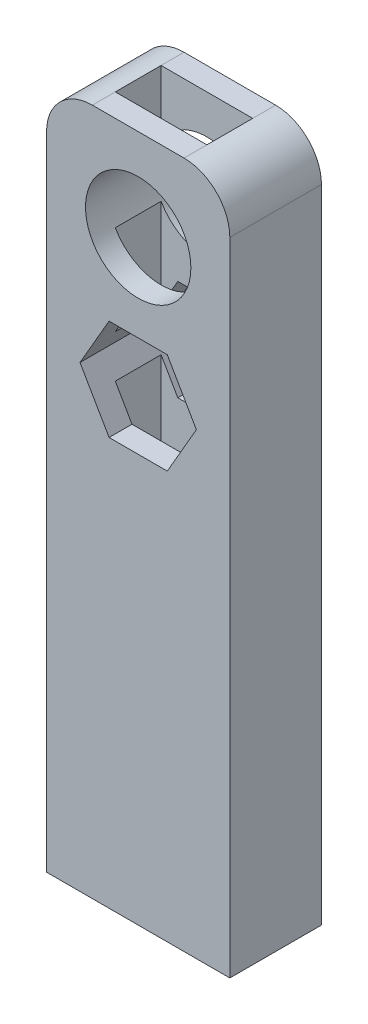
ISO-10303-21;
HEADER;
FILE_DESCRIPTION(('STEP AP214'),'2;1');
FILE_NAME('part.step','',(''),(''),'','','');
FILE_SCHEMA(('AUTOMOTIVE_DESIGN { 1 0 10303 214 1 1 1 1 }'));
ENDSEC;
DATA;
#1=APPLICATION_CONTEXT('core data for automotive mechanical design processes');
#2=APPLICATION_PROTOCOL_DEFINITION('international standard','automotive_design',2000,#1);
#3=PRODUCT_CONTEXT('',#1,'mechanical');
#4=PRODUCT('Part','Part','',(#3));
#5=PRODUCT_RELATED_PRODUCT_CATEGORY('part','',(#4));
#6=PRODUCT_DEFINITION_FORMATION('','',#4);
#7=PRODUCT_DEFINITION_CONTEXT('part definition',#1,'design');
#8=PRODUCT_DEFINITION('design','',#6,#7);
#9=PRODUCT_DEFINITION_SHAPE('','',#8);
#10=(LENGTH_UNIT() NAMED_UNIT(*) SI_UNIT(.MILLI.,.METRE.));
#11=(NAMED_UNIT(*) PLANE_ANGLE_UNIT() SI_UNIT($,.RADIAN.));
#12=(NAMED_UNIT(*) SI_UNIT($,.STERADIAN.) SOLID_ANGLE_UNIT());
#13=UNCERTAINTY_MEASURE_WITH_UNIT(LENGTH_MEASURE(1.E-05),#10,'distance_accuracy_value','');
#14=(GEOMETRIC_REPRESENTATION_CONTEXT(3) GLOBAL_UNCERTAINTY_ASSIGNED_CONTEXT((#13)) GLOBAL_UNIT_ASSIGNED_CONTEXT((#10,
#11,#12)) REPRESENTATION_CONTEXT('',''));
#15=CARTESIAN_POINT('',(0.,0.,0.));
#16=DIRECTION('',(0.,0.,1.));
#17=DIRECTION('',(1.,0.,0.));
#18=AXIS2_PLACEMENT_3D('',#15,#16,#17);
#19=CARTESIAN_POINT('',(0.,150.,0.));
#20=DIRECTION('',(0.,1.,0.));
#21=DIRECTION('',(0.,0.,1.));
#22=AXIS2_PLACEMENT_3D('',#19,#20,#21);
#23=PLANE('',#22);
#24=DIRECTION('',(1.,0.,0.));
#25=VECTOR('',#24,1.);
#26=CARTESIAN_POINT('',(-40.,150.,-20.));
#27=LINE('',#26,#25);
#28=CARTESIAN_POINT('',(-30.,150.,-20.));
#29=VERTEX_POINT('',#28);
#30=CARTESIAN_POINT('',(-10.,150.,-20.));
#31=VERTEX_POINT('',#30);
#32=EDGE_CURVE('E448',#29,#31,#27,.T.);
#33=ORIENTED_EDGE('',*,*,#32,.F.);
#34=DIRECTION('',(0.,0.,1.));
#35=VECTOR('',#34,1.);
#36=CARTESIAN_POINT('',(-30.,150.,0.));
#37=LINE('',#36,#35);
#38=CARTESIAN_POINT('',(-30.,150.,-15.));
#39=VERTEX_POINT('',#38);
#40=EDGE_CURVE('E515',#29,#39,#37,.T.);
#41=ORIENTED_EDGE('',*,*,#40,.T.);
#42=DIRECTION('',(-1.,0.,0.));
#43=VECTOR('',#42,1.);
#44=CARTESIAN_POINT('',(0.,150.,-15.));
#45=LINE('',#44,#43);
#46=CARTESIAN_POINT('',(-10.,150.,-15.));
#47=VERTEX_POINT('',#46);
#48=EDGE_CURVE('E329',#47,#39,#45,.T.);
#49=ORIENTED_EDGE('',*,*,#48,.F.);
#50=DIRECTION('',(0.,0.,1.));
#51=VECTOR('',#50,1.);
#52=CARTESIAN_POINT('',(-10.,150.,0.));
#53=LINE('',#52,#51);
#54=EDGE_CURVE('E502',#47,#31,#53,.F.);
#55=ORIENTED_EDGE('',*,*,#54,.T.);
#56=EDGE_LOOP('',(#33,#41,#49,#55));
#57=FACE_BOUND('',#56,.T.);
#58=ADVANCED_FACE('F39',(#57),#23,.T.);
#59=CARTESIAN_POINT('',(-13.6491470389141,111.,-20.));
#60=DIRECTION('',(0.,1.,0.));
#61=DIRECTION('',(-1.,0.,0.));
#62=AXIS2_PLACEMENT_3D('',#59,#60,#61);
#63=PLANE('',#62);
#64=DIRECTION('',(0.,0.,1.));
#65=VECTOR('',#64,1.);
#66=CARTESIAN_POINT('',(-13.6491470389141,111.,-20.));
#67=LINE('',#66,#65);
#68=CARTESIAN_POINT('',(-13.6491470389141,111.,-20.));
#69=VERTEX_POINT('',#68);
#70=CARTESIAN_POINT('',(-13.6491470389141,111.,-15.));
#71=VERTEX_POINT('',#70);
#72=EDGE_CURVE('E411',#69,#71,#67,.T.);
#73=ORIENTED_EDGE('',*,*,#72,.T.);
#74=DIRECTION('',(-1.,0.,0.));
#75=VECTOR('',#74,1.);
#76=CARTESIAN_POINT('',(-13.6491470389141,111.,-15.));
#77=LINE('',#76,#75);
#78=CARTESIAN_POINT('',(-26.3508529610859,111.,-15.));
#79=VERTEX_POINT('',#78);
#80=EDGE_CURVE('E304',#71,#79,#77,.T.);
#81=ORIENTED_EDGE('',*,*,#80,.T.);
#82=DIRECTION('',(0.,0.,1.));
#83=VECTOR('',#82,1.);
#84=CARTESIAN_POINT('',(-26.3508529610859,111.,-20.));
#85=LINE('',#84,#83);
#86=CARTESIAN_POINT('',(-26.3508529610859,111.,-20.));
#87=VERTEX_POINT('',#86);
#88=EDGE_CURVE('E433',#87,#79,#85,.T.);
#89=ORIENTED_EDGE('',*,*,#88,.F.);
#90=DIRECTION('',(-1.,0.,0.));
#91=VECTOR('',#90,1.);
#92=CARTESIAN_POINT('',(-13.6491470389141,111.,-20.));
#93=LINE('',#92,#91);
#94=EDGE_CURVE('E363',#69,#87,#93,.T.);
#95=ORIENTED_EDGE('',*,*,#94,.F.);
#96=EDGE_LOOP('',(#73,#81,#89,#95));
#97=FACE_BOUND('',#96,.T.);
#98=ADVANCED_FACE('F607',(#97),#63,.F.);
#99=CARTESIAN_POINT('',(-26.3508529610859,89.,-20.));
#100=DIRECTION('',(0.,-1.,0.));
#101=DIRECTION('',(0.,0.,-1.));
#102=AXIS2_PLACEMENT_3D('',#99,#100,#101);
#103=PLANE('',#102);
#104=DIRECTION('',(0.,0.,1.));
#105=VECTOR('',#104,1.);
#106=CARTESIAN_POINT('',(-26.3508529610859,89.,-20.));
#107=LINE('',#106,#105);
#108=CARTESIAN_POINT('',(-26.3508529610859,89.,-20.));
#109=VERTEX_POINT('',#108);
#110=CARTESIAN_POINT('',(-26.3508529610859,89.,-15.));
#111=VERTEX_POINT('',#110);
#112=EDGE_CURVE('E425',#109,#111,#107,.T.);
#113=ORIENTED_EDGE('',*,*,#112,.T.);
#114=DIRECTION('',(1.,0.,0.));
#115=VECTOR('',#114,1.);
#116=CARTESIAN_POINT('',(-26.3508529610859,89.,-15.));
#117=LINE('',#116,#115);
#118=CARTESIAN_POINT('',(-13.6491470389141,89.,-15.));
#119=VERTEX_POINT('',#118);
#120=EDGE_CURVE('E316',#111,#119,#117,.T.);
#121=ORIENTED_EDGE('',*,*,#120,.T.);
#122=DIRECTION('',(0.,0.,1.));
#123=VECTOR('',#122,1.);
#124=CARTESIAN_POINT('',(-13.6491470389141,89.,-20.));
#125=LINE('',#124,#123);
#126=CARTESIAN_POINT('',(-13.6491470389141,89.,-20.));
#127=VERTEX_POINT('',#126);
#128=EDGE_CURVE('E420',#127,#119,#125,.T.);
#129=ORIENTED_EDGE('',*,*,#128,.F.);
#130=DIRECTION('',(1.,0.,0.));
#131=VECTOR('',#130,1.);
#132=CARTESIAN_POINT('',(-26.3508529610859,89.,-20.));
#133=LINE('',#132,#131);
#134=EDGE_CURVE('E376',#109,#127,#133,.T.);
#135=ORIENTED_EDGE('',*,*,#134,.F.);
#136=EDGE_LOOP('',(#113,#121,#129,#135));
#137=FACE_BOUND('',#136,.T.);
#138=ADVANCED_FACE('F603',(#137),#103,.F.);
#139=CARTESIAN_POINT('',(-40.,150.,-20.));
#140=DIRECTION('',(1.,0.,0.));
#141=DIRECTION('',(0.,0.,-1.));
#142=AXIS2_PLACEMENT_3D('',#139,#140,#141);
#143=PLANE('',#142);
#144=DIRECTION('',(0.,-1.,0.));
#145=VECTOR('',#144,1.);
#146=CARTESIAN_POINT('',(-40.,150.,0.));
#147=LINE('',#146,#145);
#148=CARTESIAN_POINT('',(-40.,140.,0.));
#149=VERTEX_POINT('',#148);
#150=CARTESIAN_POINT('',(-40.,0.,0.));
#151=VERTEX_POINT('',#150);
#152=EDGE_CURVE('E475',#149,#151,#147,.T.);
#153=ORIENTED_EDGE('',*,*,#152,.F.);
#154=DIRECTION('',(0.,0.,1.));
#155=VECTOR('',#154,1.);
#156=CARTESIAN_POINT('',(-40.,140.,-20.));
#157=LINE('',#156,#155);
#158=CARTESIAN_POINT('',(-40.,140.,-20.));
#159=VERTEX_POINT('',#158);
#160=EDGE_CURVE('E48',#149,#159,#157,.F.);
#161=ORIENTED_EDGE('',*,*,#160,.T.);
#162=DIRECTION('',(0.,-1.,0.));
#163=VECTOR('',#162,1.);
#164=CARTESIAN_POINT('',(-40.,150.,-20.));
#165=LINE('',#164,#163);
#166=CARTESIAN_POINT('',(-40.,0.,-20.));
#167=VERTEX_POINT('',#166);
#168=EDGE_CURVE('E452',#159,#167,#165,.T.);
#169=ORIENTED_EDGE('',*,*,#168,.T.);
#170=DIRECTION('',(0.,0.,1.));
#171=VECTOR('',#170,1.);
#172=CARTESIAN_POINT('',(-40.,0.,-20.));
#173=LINE('',#172,#171);
#174=EDGE_CURVE('E441',#167,#151,#173,.T.);
#175=ORIENTED_EDGE('',*,*,#174,.T.);
#176=EDGE_LOOP('',(#153,#161,#169,#175));
#177=FACE_BOUND('',#176,.T.);
#178=ADVANCED_FACE('F576',(#177),#143,.F.);
#179=CARTESIAN_POINT('',(-40.,150.,0.));
#180=DIRECTION('',(0.,0.,-1.));
#181=DIRECTION('',(-1.,0.,0.));
#182=AXIS2_PLACEMENT_3D('',#179,#180,#181);
#183=PLANE('',#182);
#184=DIRECTION('',(-0.5,-0.866025403784439,0.));
#185=VECTOR('',#184,1.);
#186=CARTESIAN_POINT('',(-26.3508529610859,111.,0.));
#187=LINE('',#186,#185);
#188=CARTESIAN_POINT('',(-26.3508529610859,111.,0.));
#189=VERTEX_POINT('',#188);
#190=CARTESIAN_POINT('',(-32.7017059221718,100.,0.));
#191=VERTEX_POINT('',#190);
#192=EDGE_CURVE('E392',#189,#191,#187,.T.);
#193=ORIENTED_EDGE('',*,*,#192,.F.);
#194=DIRECTION('',(-1.,0.,0.));
#195=VECTOR('',#194,1.);
#196=CARTESIAN_POINT('',(-13.6491470389141,111.,0.));
#197=LINE('',#196,#195);
#198=CARTESIAN_POINT('',(-13.6491470389141,111.,0.));
#199=VERTEX_POINT('',#198);
#200=EDGE_CURVE('E362',#199,#189,#197,.T.);
#201=ORIENTED_EDGE('',*,*,#200,.F.);
#202=DIRECTION('',(-0.500000000000001,0.866025403784438,0.));
#203=VECTOR('',#202,1.);
#204=CARTESIAN_POINT('',(-7.29829407782825,100.,0.));
#205=LINE('',#204,#203);
#206=CARTESIAN_POINT('',(-7.29829407782825,100.,0.));
#207=VERTEX_POINT('',#206);
#208=EDGE_CURVE('E368',#207,#199,#205,.T.);
#209=ORIENTED_EDGE('',*,*,#208,.F.);
#210=DIRECTION('',(0.5,0.866025403784439,0.));
#211=VECTOR('',#210,1.);
#212=CARTESIAN_POINT('',(-13.6491470389141,89.,0.));
#213=LINE('',#212,#211);
#214=CARTESIAN_POINT('',(-13.6491470389141,89.,0.));
#215=VERTEX_POINT('',#214);
#216=EDGE_CURVE('E404',#215,#207,#213,.T.);
#217=ORIENTED_EDGE('',*,*,#216,.F.);
#218=DIRECTION('',(1.,0.,0.));
#219=VECTOR('',#218,1.);
#220=CARTESIAN_POINT('',(-26.3508529610859,89.,0.));
#221=LINE('',#220,#219);
#222=CARTESIAN_POINT('',(-26.3508529610859,89.,0.));
#223=VERTEX_POINT('',#222);
#224=EDGE_CURVE('E400',#223,#215,#221,.T.);
#225=ORIENTED_EDGE('',*,*,#224,.F.);
#226=DIRECTION('',(0.5,-0.866025403784439,0.));
#227=VECTOR('',#226,1.);
#228=CARTESIAN_POINT('',(-32.7017059221718,100.,0.));
#229=LINE('',#228,#227);
#230=EDGE_CURVE('E396',#191,#223,#229,.T.);
#231=ORIENTED_EDGE('',*,*,#230,.F.);
#232=EDGE_LOOP('',(#193,#201,#209,#217,#225,#231));
#233=FACE_BOUND('',#232,.T.);
#234=CARTESIAN_POINT('',(-20.,130.,0.));
#235=DIRECTION('',(0.,0.,1.));
#236=DIRECTION('',(1.,0.,0.));
#237=AXIS2_PLACEMENT_3D('',#234,#235,#236);
#238=CIRCLE('',#237,11.5);
#239=CARTESIAN_POINT('',(-8.49999999999999,130.,0.));
#240=VERTEX_POINT('',#239);
#241=EDGE_CURVE('E415',#240,#240,#238,.T.);
#242=ORIENTED_EDGE('',*,*,#241,.F.);
#243=EDGE_LOOP('',(#242));
#244=FACE_BOUND('',#243,.T.);
#245=DIRECTION('',(1.,0.,0.));
#246=VECTOR('',#245,1.);
#247=CARTESIAN_POINT('',(-40.,150.,0.));
#248=LINE('',#247,#246);
#249=CARTESIAN_POINT('',(-30.,150.,0.));
#250=VERTEX_POINT('',#249);
#251=CARTESIAN_POINT('',(-10.,150.,0.));
#252=VERTEX_POINT('',#251);
#253=EDGE_CURVE('E445',#250,#252,#248,.T.);
#254=ORIENTED_EDGE('',*,*,#253,.F.);
#255=CARTESIAN_POINT('',(-30.,140.,0.));
#256=DIRECTION('',(0.,0.,-1.));
#257=DIRECTION('',(-1.,0.,0.));
#258=AXIS2_PLACEMENT_3D('',#255,#256,#257);
#259=CIRCLE('',#258,10.);
#260=EDGE_CURVE('E62',#250,#149,#259,.F.);
#261=ORIENTED_EDGE('',*,*,#260,.T.);
#262=ORIENTED_EDGE('',*,*,#152,.T.);
#263=DIRECTION('',(1.,0.,0.));
#264=VECTOR('',#263,1.);
#265=CARTESIAN_POINT('',(-40.,0.,0.));
#266=LINE('',#265,#264);
#267=CARTESIAN_POINT('',(0.,0.,0.));
#268=VERTEX_POINT('',#267);
#269=EDGE_CURVE('E456',#151,#268,#266,.T.);
#270=ORIENTED_EDGE('',*,*,#269,.T.);
#271=DIRECTION('',(0.,-1.,0.));
#272=VECTOR('',#271,1.);
#273=CARTESIAN_POINT('',(0.,150.,0.));
#274=LINE('',#273,#272);
#275=CARTESIAN_POINT('',(0.,140.,0.));
#276=VERTEX_POINT('',#275);
#277=EDGE_CURVE('E472',#276,#268,#274,.T.);
#278=ORIENTED_EDGE('',*,*,#277,.F.);
#279=CARTESIAN_POINT('',(-10.,140.,0.));
#280=DIRECTION('',(0.,0.,-1.));
#281=DIRECTION('',(-1.,0.,0.));
#282=AXIS2_PLACEMENT_3D('',#279,#280,#281);
#283=CIRCLE('',#282,10.);
#284=EDGE_CURVE('E498',#276,#252,#283,.F.);
#285=ORIENTED_EDGE('',*,*,#284,.T.);
#286=EDGE_LOOP('',(#254,#261,#262,#270,#278,#285));
#287=FACE_BOUND('',#286,.T.);
#288=ADVANCED_FACE('F577',(#233,#244,#287),#183,.F.);
#289=CARTESIAN_POINT('',(0.,150.,-20.));
#290=DIRECTION('',(1.,0.,0.));
#291=DIRECTION('',(0.,0.,-1.));
#292=AXIS2_PLACEMENT_3D('',#289,#290,#291);
#293=PLANE('',#292);
#294=DIRECTION('',(0.,-1.,0.));
#295=VECTOR('',#294,1.);
#296=CARTESIAN_POINT('',(0.,150.,-20.));
#297=LINE('',#296,#295);
#298=CARTESIAN_POINT('',(0.,140.,-20.));
#299=VERTEX_POINT('',#298);
#300=CARTESIAN_POINT('',(0.,0.,-20.));
#301=VERTEX_POINT('',#300);
#302=EDGE_CURVE('E469',#299,#301,#297,.T.);
#303=ORIENTED_EDGE('',*,*,#302,.F.);
#304=DIRECTION('',(0.,0.,1.));
#305=VECTOR('',#304,1.);
#306=CARTESIAN_POINT('',(0.,140.,-20.));
#307=LINE('',#306,#305);
#308=EDGE_CURVE('E494',#299,#276,#307,.T.);
#309=ORIENTED_EDGE('',*,*,#308,.T.);
#310=ORIENTED_EDGE('',*,*,#277,.T.);
#311=DIRECTION('',(0.,0.,1.));
#312=VECTOR('',#311,1.);
#313=CARTESIAN_POINT('',(0.,0.,-20.));
#314=LINE('',#313,#312);
#315=EDGE_CURVE('E460',#301,#268,#314,.T.);
#316=ORIENTED_EDGE('',*,*,#315,.F.);
#317=EDGE_LOOP('',(#303,#309,#310,#316));
#318=FACE_BOUND('',#317,.T.);
#319=ADVANCED_FACE('F572',(#318),#293,.T.);
#320=CARTESIAN_POINT('',(-40.,150.,-20.));
#321=DIRECTION('',(0.,0.,-1.));
#322=DIRECTION('',(-1.,0.,0.));
#323=AXIS2_PLACEMENT_3D('',#320,#321,#322);
#324=PLANE('',#323);
#325=ORIENTED_EDGE('',*,*,#94,.T.);
#326=DIRECTION('',(-0.5,-0.866025403784439,0.));
#327=VECTOR('',#326,1.);
#328=CARTESIAN_POINT('',(-26.3508529610859,111.,-20.));
#329=LINE('',#328,#327);
#330=CARTESIAN_POINT('',(-32.7017059221718,100.,-20.));
#331=VERTEX_POINT('',#330);
#332=EDGE_CURVE('E367',#87,#331,#329,.T.);
#333=ORIENTED_EDGE('',*,*,#332,.T.);
#334=DIRECTION('',(0.5,-0.866025403784439,0.));
#335=VECTOR('',#334,1.);
#336=CARTESIAN_POINT('',(-32.7017059221718,100.,-20.));
#337=LINE('',#336,#335);
#338=EDGE_CURVE('E372',#331,#109,#337,.T.);
#339=ORIENTED_EDGE('',*,*,#338,.T.);
#340=ORIENTED_EDGE('',*,*,#134,.T.);
#341=DIRECTION('',(0.5,0.866025403784439,0.));
#342=VECTOR('',#341,1.);
#343=CARTESIAN_POINT('',(-13.6491470389141,89.,-20.));
#344=LINE('',#343,#342);
#345=CARTESIAN_POINT('',(-7.29829407782825,100.,-20.));
#346=VERTEX_POINT('',#345);
#347=EDGE_CURVE('E380',#127,#346,#344,.T.);
#348=ORIENTED_EDGE('',*,*,#347,.T.);
#349=DIRECTION('',(-0.500000000000001,0.866025403784438,0.));
#350=VECTOR('',#349,1.);
#351=CARTESIAN_POINT('',(-7.29829407782825,100.,-20.));
#352=LINE('',#351,#350);
#353=EDGE_CURVE('E384',#346,#69,#352,.T.);
#354=ORIENTED_EDGE('',*,*,#353,.T.);
#355=EDGE_LOOP('',(#325,#333,#339,#340,#348,#354));
#356=FACE_BOUND('',#355,.T.);
#357=CARTESIAN_POINT('',(-20.,130.,-20.));
#358=DIRECTION('',(0.,0.,1.));
#359=DIRECTION('',(1.,0.,0.));
#360=AXIS2_PLACEMENT_3D('',#357,#358,#359);
#361=CIRCLE('',#360,11.5);
#362=CARTESIAN_POINT('',(-8.49999999999999,130.,-20.));
#363=VERTEX_POINT('',#362);
#364=EDGE_CURVE('E437',#363,#363,#361,.T.);
#365=ORIENTED_EDGE('',*,*,#364,.T.);
#366=EDGE_LOOP('',(#365));
#367=FACE_BOUND('',#366,.T.);
#368=ORIENTED_EDGE('',*,*,#168,.F.);
#369=CARTESIAN_POINT('',(-30.,140.,-20.));
#370=DIRECTION('',(0.,0.,-1.));
#371=DIRECTION('',(-1.,0.,0.));
#372=AXIS2_PLACEMENT_3D('',#369,#370,#371);
#373=CIRCLE('',#372,10.);
#374=EDGE_CURVE('E11',#159,#29,#373,.T.);
#375=ORIENTED_EDGE('',*,*,#374,.T.);
#376=ORIENTED_EDGE('',*,*,#32,.T.);
#377=CARTESIAN_POINT('',(-10.,140.,-20.));
#378=DIRECTION('',(0.,0.,-1.));
#379=DIRECTION('',(-1.,0.,0.));
#380=AXIS2_PLACEMENT_3D('',#377,#378,#379);
#381=CIRCLE('',#380,10.);
#382=EDGE_CURVE('E509',#31,#299,#381,.T.);
#383=ORIENTED_EDGE('',*,*,#382,.T.);
#384=ORIENTED_EDGE('',*,*,#302,.T.);
#385=DIRECTION('',(1.,0.,0.));
#386=VECTOR('',#385,1.);
#387=CARTESIAN_POINT('',(-40.,0.,-20.));
#388=LINE('',#387,#386);
#389=EDGE_CURVE('E449',#167,#301,#388,.T.);
#390=ORIENTED_EDGE('',*,*,#389,.F.);
#391=EDGE_LOOP('',(#368,#375,#376,#383,#384,#390));
#392=FACE_BOUND('',#391,.T.);
#393=ADVANCED_FACE('F559',(#356,#367,#392),#324,.T.);
#394=DIRECTION('',(1.,0.,0.));
#395=VECTOR('',#394,1.);
#396=CARTESIAN_POINT('',(0.,150.,-5.));
#397=LINE('',#396,#395);
#398=CARTESIAN_POINT('',(-30.,150.,-5.));
#399=VERTEX_POINT('',#398);
#400=CARTESIAN_POINT('',(-10.,150.,-5.));
#401=VERTEX_POINT('',#400);
#402=EDGE_CURVE('E300',#399,#401,#397,.T.);
#403=ORIENTED_EDGE('',*,*,#402,.F.);
#404=DIRECTION('',(0.,0.,1.));
#405=VECTOR('',#404,1.);
#406=CARTESIAN_POINT('',(-30.,150.,0.));
#407=LINE('',#406,#405);
#408=EDGE_CURVE('E512',#399,#250,#407,.T.);
#409=ORIENTED_EDGE('',*,*,#408,.T.);
#410=ORIENTED_EDGE('',*,*,#253,.T.);
#411=DIRECTION('',(0.,0.,1.));
#412=VECTOR('',#411,1.);
#413=CARTESIAN_POINT('',(-10.,150.,0.));
#414=LINE('',#413,#412);
#415=EDGE_CURVE('E506',#252,#401,#414,.F.);
#416=ORIENTED_EDGE('',*,*,#415,.T.);
#417=EDGE_LOOP('',(#403,#409,#410,#416));
#418=FACE_BOUND('',#417,.T.);
#419=ADVANCED_FACE('F554',(#418),#23,.T.);
#420=CARTESIAN_POINT('',(0.,0.,0.));
#421=DIRECTION('',(0.,1.,0.));
#422=DIRECTION('',(0.,0.,1.));
#423=AXIS2_PLACEMENT_3D('',#420,#421,#422);
#424=PLANE('',#423);
#425=DIRECTION('',(-1.,0.,0.));
#426=VECTOR('',#425,1.);
#427=CARTESIAN_POINT('',(-30.,0.,-15.));
#428=LINE('',#427,#426);
#429=CARTESIAN_POINT('',(-10.,0.,-15.));
#430=VERTEX_POINT('',#429);
#431=CARTESIAN_POINT('',(-30.,0.,-15.));
#432=VERTEX_POINT('',#431);
#433=EDGE_CURVE('E254',#430,#432,#428,.T.);
#434=ORIENTED_EDGE('',*,*,#433,.T.);
#435=DIRECTION('',(0.,0.,1.));
#436=VECTOR('',#435,1.);
#437=CARTESIAN_POINT('',(-30.,0.,-5.));
#438=LINE('',#437,#436);
#439=CARTESIAN_POINT('',(-30.,0.,-5.));
#440=VERTEX_POINT('',#439);
#441=EDGE_CURVE('E229',#432,#440,#438,.T.);
#442=ORIENTED_EDGE('',*,*,#441,.T.);
#443=DIRECTION('',(1.,0.,0.));
#444=VECTOR('',#443,1.);
#445=CARTESIAN_POINT('',(-30.,0.,-5.));
#446=LINE('',#445,#444);
#447=CARTESIAN_POINT('',(-10.,0.,-5.));
#448=VERTEX_POINT('',#447);
#449=EDGE_CURVE('E242',#440,#448,#446,.T.);
#450=ORIENTED_EDGE('',*,*,#449,.T.);
#451=DIRECTION('',(0.,0.,-1.));
#452=VECTOR('',#451,1.);
#453=CARTESIAN_POINT('',(-10.,0.,-5.));
#454=LINE('',#453,#452);
#455=EDGE_CURVE('E249',#448,#430,#454,.T.);
#456=ORIENTED_EDGE('',*,*,#455,.T.);
#457=EDGE_LOOP('',(#434,#442,#450,#456));
#458=FACE_BOUND('',#457,.T.);
#459=ORIENTED_EDGE('',*,*,#174,.F.);
#460=ORIENTED_EDGE('',*,*,#389,.T.);
#461=ORIENTED_EDGE('',*,*,#315,.T.);
#462=ORIENTED_EDGE('',*,*,#269,.F.);
#463=EDGE_LOOP('',(#459,#460,#461,#462));
#464=FACE_BOUND('',#463,.T.);
#465=ADVANCED_FACE('F251',(#458,#464),#424,.F.);
#466=CARTESIAN_POINT('',(-20.,130.,-20.));
#467=DIRECTION('',(0.,0.,1.));
#468=DIRECTION('',(1.,0.,0.));
#469=AXIS2_PLACEMENT_3D('',#466,#467,#468);
#470=CYLINDRICAL_SURFACE('',#469,11.5);
#471=CARTESIAN_POINT('',(-20.,130.,-5.));
#472=DIRECTION('',(0.,0.,1.));
#473=DIRECTION('',(1.,0.,0.));
#474=AXIS2_PLACEMENT_3D('',#471,#472,#473);
#475=CIRCLE('',#474,11.5);
#476=CARTESIAN_POINT('',(-10.,124.3210916542,-5.));
#477=VERTEX_POINT('',#476);
#478=CARTESIAN_POINT('',(-30.,124.3210916542,-5.));
#479=VERTEX_POINT('',#478);
#480=EDGE_CURVE('E299',#477,#479,#475,.F.);
#481=ORIENTED_EDGE('',*,*,#480,.T.);
#482=DIRECTION('',(0.,0.,1.));
#483=VECTOR('',#482,1.);
#484=CARTESIAN_POINT('',(-30.,124.3210916542,-20.));
#485=LINE('',#484,#483);
#486=CARTESIAN_POINT('',(-30.,124.3210916542,-15.));
#487=VERTEX_POINT('',#486);
#488=EDGE_CURVE('E339',#479,#487,#485,.F.);
#489=ORIENTED_EDGE('',*,*,#488,.T.);
#490=CARTESIAN_POINT('',(-20.,130.,-15.));
#491=DIRECTION('',(0.,0.,-1.));
#492=DIRECTION('',(-1.,0.,0.));
#493=AXIS2_PLACEMENT_3D('',#490,#491,#492);
#494=CIRCLE('',#493,11.5);
#495=CARTESIAN_POINT('',(-10.,124.3210916542,-15.));
#496=VERTEX_POINT('',#495);
#497=EDGE_CURVE('E328',#487,#496,#494,.F.);
#498=ORIENTED_EDGE('',*,*,#497,.T.);
#499=DIRECTION('',(0.,0.,1.));
#500=VECTOR('',#499,1.);
#501=CARTESIAN_POINT('',(-10.,124.3210916542,-20.));
#502=LINE('',#501,#500);
#503=EDGE_CURVE('E351',#496,#477,#502,.T.);
#504=ORIENTED_EDGE('',*,*,#503,.T.);
#505=EDGE_LOOP('',(#481,#489,#498,#504));
#506=FACE_BOUND('',#505,.T.);
#507=CARTESIAN_POINT('',(-10.,135.6789083458,-15.));
#508=VERTEX_POINT('',#507);
#509=CARTESIAN_POINT('',(-30.,135.6789083458,-15.));
#510=VERTEX_POINT('',#509);
#511=EDGE_CURVE('E324',#508,#510,#494,.F.);
#512=ORIENTED_EDGE('',*,*,#511,.T.);
#513=DIRECTION('',(0.,0.,1.));
#514=VECTOR('',#513,1.);
#515=CARTESIAN_POINT('',(-30.,135.6789083458,-20.));
#516=LINE('',#515,#514);
#517=CARTESIAN_POINT('',(-30.,135.6789083458,-5.));
#518=VERTEX_POINT('',#517);
#519=EDGE_CURVE('E335',#510,#518,#516,.T.);
#520=ORIENTED_EDGE('',*,*,#519,.T.);
#521=CARTESIAN_POINT('',(-10.,135.6789083458,-5.));
#522=VERTEX_POINT('',#521);
#523=EDGE_CURVE('E295',#518,#522,#475,.F.);
#524=ORIENTED_EDGE('',*,*,#523,.T.);
#525=DIRECTION('',(0.,0.,1.));
#526=VECTOR('',#525,1.);
#527=CARTESIAN_POINT('',(-10.,135.6789083458,-20.));
#528=LINE('',#527,#526);
#529=EDGE_CURVE('E355',#522,#508,#528,.F.);
#530=ORIENTED_EDGE('',*,*,#529,.T.);
#531=EDGE_LOOP('',(#512,#520,#524,#530));
#532=FACE_BOUND('',#531,.T.);
#533=ORIENTED_EDGE('',*,*,#364,.F.);
#534=EDGE_LOOP('',(#533));
#535=FACE_BOUND('',#534,.T.);
#536=ORIENTED_EDGE('',*,*,#241,.T.);
#537=EDGE_LOOP('',(#536));
#538=FACE_BOUND('',#537,.T.);
#539=ADVANCED_FACE('F585',(#506,#532,#535,#538),#470,.F.);
#540=CARTESIAN_POINT('',(-26.3508529610859,111.,-5.));
#541=VERTEX_POINT('',#540);
#542=EDGE_CURVE('E388',#541,#189,#85,.T.);
#543=ORIENTED_EDGE('',*,*,#542,.F.);
#544=DIRECTION('',(1.,0.,0.));
#545=VECTOR('',#544,1.);
#546=CARTESIAN_POINT('',(-13.6491470389141,111.,-5.));
#547=LINE('',#546,#545);
#548=CARTESIAN_POINT('',(-13.6491470389141,111.,-5.));
#549=VERTEX_POINT('',#548);
#550=EDGE_CURVE('E265',#541,#549,#547,.T.);
#551=ORIENTED_EDGE('',*,*,#550,.T.);
#552=EDGE_CURVE('E416',#549,#199,#67,.T.);
#553=ORIENTED_EDGE('',*,*,#552,.T.);
#554=ORIENTED_EDGE('',*,*,#200,.T.);
#555=EDGE_LOOP('',(#543,#551,#553,#554));
#556=FACE_BOUND('',#555,.T.);
#557=ADVANCED_FACE('F588',(#556),#63,.F.);
#558=CARTESIAN_POINT('',(-7.29829407782825,100.,-20.));
#559=DIRECTION('',(0.866025403784438,0.500000000000001,0.));
#560=DIRECTION('',(-0.500000000000001,0.866025403784438,0.));
#561=AXIS2_PLACEMENT_3D('',#558,#559,#560);
#562=PLANE('',#561);
#563=DIRECTION('',(0.,0.,-1.));
#564=VECTOR('',#563,1.);
#565=CARTESIAN_POINT('',(-10.,104.679491924311,-20.));
#566=LINE('',#565,#564);
#567=CARTESIAN_POINT('',(-9.99999999999997,104.679491924311,-5.));
#568=VERTEX_POINT('',#567);
#569=CARTESIAN_POINT('',(-10.,104.679491924311,-15.));
#570=VERTEX_POINT('',#569);
#571=EDGE_CURVE('E347',#568,#570,#566,.T.);
#572=ORIENTED_EDGE('',*,*,#571,.T.);
#573=DIRECTION('',(-0.500000000000001,0.866025403784438,0.));
#574=VECTOR('',#573,1.);
#575=CARTESIAN_POINT('',(-7.29829407782825,100.,-15.));
#576=LINE('',#575,#574);
#577=EDGE_CURVE('E308',#570,#71,#576,.T.);
#578=ORIENTED_EDGE('',*,*,#577,.T.);
#579=ORIENTED_EDGE('',*,*,#72,.F.);
#580=ORIENTED_EDGE('',*,*,#353,.F.);
#581=DIRECTION('',(0.,0.,1.));
#582=VECTOR('',#581,1.);
#583=CARTESIAN_POINT('',(-7.29829407782825,100.,-20.));
#584=LINE('',#583,#582);
#585=EDGE_CURVE('E417',#346,#207,#584,.T.);
#586=ORIENTED_EDGE('',*,*,#585,.T.);
#587=ORIENTED_EDGE('',*,*,#208,.T.);
#588=ORIENTED_EDGE('',*,*,#552,.F.);
#589=DIRECTION('',(0.500000000000001,-0.866025403784438,0.));
#590=VECTOR('',#589,1.);
#591=CARTESIAN_POINT('',(-7.29829407782825,100.,-5.));
#592=LINE('',#591,#590);
#593=EDGE_CURVE('E280',#549,#568,#592,.T.);
#594=ORIENTED_EDGE('',*,*,#593,.T.);
#595=EDGE_LOOP('',(#572,#578,#579,#580,#586,#587,#588,#594));
#596=FACE_BOUND('',#595,.T.);
#597=ADVANCED_FACE('F644',(#596),#562,.F.);
#598=CARTESIAN_POINT('',(-13.6491470389141,89.,-20.));
#599=DIRECTION('',(0.866025403784439,-0.5,0.));
#600=DIRECTION('',(0.5,0.866025403784439,0.));
#601=AXIS2_PLACEMENT_3D('',#598,#599,#600);
#602=PLANE('',#601);
#603=ORIENTED_EDGE('',*,*,#128,.T.);
#604=DIRECTION('',(0.5,0.866025403784439,0.));
#605=VECTOR('',#604,1.);
#606=CARTESIAN_POINT('',(-13.6491470389141,89.,-15.));
#607=LINE('',#606,#605);
#608=CARTESIAN_POINT('',(-10.,95.3205080756888,-15.));
#609=VERTEX_POINT('',#608);
#610=EDGE_CURVE('E320',#119,#609,#607,.T.);
#611=ORIENTED_EDGE('',*,*,#610,.T.);
#612=DIRECTION('',(0.,0.,1.));
#613=VECTOR('',#612,1.);
#614=CARTESIAN_POINT('',(-10.,95.3205080756888,-20.));
#615=LINE('',#614,#613);
#616=CARTESIAN_POINT('',(-10.,95.3205080756888,-5.));
#617=VERTEX_POINT('',#616);
#618=EDGE_CURVE('E490',#609,#617,#615,.T.);
#619=ORIENTED_EDGE('',*,*,#618,.T.);
#620=DIRECTION('',(-0.5,-0.866025403784439,0.));
#621=VECTOR('',#620,1.);
#622=CARTESIAN_POINT('',(-13.6491470389141,89.,-5.));
#623=LINE('',#622,#621);
#624=CARTESIAN_POINT('',(-13.6491470389141,89.,-5.));
#625=VERTEX_POINT('',#624);
#626=EDGE_CURVE('E291',#617,#625,#623,.T.);
#627=ORIENTED_EDGE('',*,*,#626,.T.);
#628=EDGE_CURVE('E424',#625,#215,#125,.T.);
#629=ORIENTED_EDGE('',*,*,#628,.T.);
#630=ORIENTED_EDGE('',*,*,#216,.T.);
#631=ORIENTED_EDGE('',*,*,#585,.F.);
#632=ORIENTED_EDGE('',*,*,#347,.F.);
#633=EDGE_LOOP('',(#603,#611,#619,#627,#629,#630,#631,#632));
#634=FACE_BOUND('',#633,.T.);
#635=ADVANCED_FACE('F640',(#634),#602,.F.);
#636=ORIENTED_EDGE('',*,*,#628,.F.);
#637=DIRECTION('',(-1.,0.,0.));
#638=VECTOR('',#637,1.);
#639=CARTESIAN_POINT('',(-26.3508529610859,89.,-5.));
#640=LINE('',#639,#638);
#641=CARTESIAN_POINT('',(-26.3508529610859,89.,-5.));
#642=VERTEX_POINT('',#641);
#643=EDGE_CURVE('E287',#625,#642,#640,.T.);
#644=ORIENTED_EDGE('',*,*,#643,.T.);
#645=EDGE_CURVE('E429',#642,#223,#107,.T.);
#646=ORIENTED_EDGE('',*,*,#645,.T.);
#647=ORIENTED_EDGE('',*,*,#224,.T.);
#648=EDGE_LOOP('',(#636,#644,#646,#647));
#649=FACE_BOUND('',#648,.T.);
#650=ADVANCED_FACE('F663',(#649),#103,.F.);
#651=CARTESIAN_POINT('',(-32.7017059221718,100.,-20.));
#652=DIRECTION('',(-0.866025403784439,-0.5,0.));
#653=DIRECTION('',(0.5,-0.866025403784439,0.));
#654=AXIS2_PLACEMENT_3D('',#651,#652,#653);
#655=PLANE('',#654);
#656=DIRECTION('',(0.,0.,-1.));
#657=VECTOR('',#656,1.);
#658=CARTESIAN_POINT('',(-30.,95.3205080756887,-20.));
#659=LINE('',#658,#657);
#660=CARTESIAN_POINT('',(-30.,95.3205080756887,-5.));
#661=VERTEX_POINT('',#660);
#662=CARTESIAN_POINT('',(-30.,95.3205080756887,-15.));
#663=VERTEX_POINT('',#662);
#664=EDGE_CURVE('E232',#661,#663,#659,.T.);
#665=ORIENTED_EDGE('',*,*,#664,.T.);
#666=DIRECTION('',(0.5,-0.866025403784439,0.));
#667=VECTOR('',#666,1.);
#668=CARTESIAN_POINT('',(-32.7017059221718,100.,-15.));
#669=LINE('',#668,#667);
#670=EDGE_CURVE('E312',#663,#111,#669,.T.);
#671=ORIENTED_EDGE('',*,*,#670,.T.);
#672=ORIENTED_EDGE('',*,*,#112,.F.);
#673=ORIENTED_EDGE('',*,*,#338,.F.);
#674=DIRECTION('',(0.,0.,1.));
#675=VECTOR('',#674,1.);
#676=CARTESIAN_POINT('',(-32.7017059221718,100.,-20.));
#677=LINE('',#676,#675);
#678=EDGE_CURVE('E430',#331,#191,#677,.T.);
#679=ORIENTED_EDGE('',*,*,#678,.T.);
#680=ORIENTED_EDGE('',*,*,#230,.T.);
#681=ORIENTED_EDGE('',*,*,#645,.F.);
#682=DIRECTION('',(-0.5,0.866025403784439,0.));
#683=VECTOR('',#682,1.);
#684=CARTESIAN_POINT('',(-32.7017059221718,100.,-5.));
#685=LINE('',#684,#683);
#686=EDGE_CURVE('E284',#642,#661,#685,.T.);
#687=ORIENTED_EDGE('',*,*,#686,.T.);
#688=EDGE_LOOP('',(#665,#671,#672,#673,#679,#680,#681,#687));
#689=FACE_BOUND('',#688,.T.);
#690=ADVANCED_FACE('F633',(#689),#655,.F.);
#691=CARTESIAN_POINT('',(-26.3508529610859,111.,-20.));
#692=DIRECTION('',(-0.866025403784439,0.5,0.));
#693=DIRECTION('',(-0.5,-0.866025403784439,0.));
#694=AXIS2_PLACEMENT_3D('',#691,#692,#693);
#695=PLANE('',#694);
#696=ORIENTED_EDGE('',*,*,#88,.T.);
#697=DIRECTION('',(-0.5,-0.866025403784439,0.));
#698=VECTOR('',#697,1.);
#699=CARTESIAN_POINT('',(-26.3508529610859,111.,-15.));
#700=LINE('',#699,#698);
#701=CARTESIAN_POINT('',(-30.,104.679491924311,-15.));
#702=VERTEX_POINT('',#701);
#703=EDGE_CURVE('E486',#79,#702,#700,.T.);
#704=ORIENTED_EDGE('',*,*,#703,.T.);
#705=DIRECTION('',(0.,0.,1.));
#706=VECTOR('',#705,1.);
#707=CARTESIAN_POINT('',(-30.,104.679491924311,-20.));
#708=LINE('',#707,#706);
#709=CARTESIAN_POINT('',(-30.,104.679491924311,-5.));
#710=VERTEX_POINT('',#709);
#711=EDGE_CURVE('E482',#702,#710,#708,.T.);
#712=ORIENTED_EDGE('',*,*,#711,.T.);
#713=DIRECTION('',(0.5,0.866025403784439,0.));
#714=VECTOR('',#713,1.);
#715=CARTESIAN_POINT('',(-26.3508529610859,111.,-5.));
#716=LINE('',#715,#714);
#717=EDGE_CURVE('E478',#710,#541,#716,.T.);
#718=ORIENTED_EDGE('',*,*,#717,.T.);
#719=ORIENTED_EDGE('',*,*,#542,.T.);
#720=ORIENTED_EDGE('',*,*,#192,.T.);
#721=ORIENTED_EDGE('',*,*,#678,.F.);
#722=ORIENTED_EDGE('',*,*,#332,.F.);
#723=EDGE_LOOP('',(#696,#704,#712,#718,#719,#720,#721,#722));
#724=FACE_BOUND('',#723,.T.);
#725=ADVANCED_FACE('F630',(#724),#695,.F.);
#726=CARTESIAN_POINT('',(-30.,0.,-15.));
#727=DIRECTION('',(0.,0.,-1.));
#728=DIRECTION('',(-1.,0.,0.));
#729=AXIS2_PLACEMENT_3D('',#726,#727,#728);
#730=PLANE('',#729);
#731=DIRECTION('',(0.,1.,0.));
#732=VECTOR('',#731,1.);
#733=CARTESIAN_POINT('',(-30.,0.,-15.));
#734=LINE('',#733,#732);
#735=EDGE_CURVE('E266',#702,#487,#734,.T.);
#736=ORIENTED_EDGE('',*,*,#735,.F.);
#737=ORIENTED_EDGE('',*,*,#703,.F.);
#738=ORIENTED_EDGE('',*,*,#80,.F.);
#739=ORIENTED_EDGE('',*,*,#577,.F.);
#740=DIRECTION('',(0.,1.,0.));
#741=VECTOR('',#740,1.);
#742=CARTESIAN_POINT('',(-10.,0.,-15.));
#743=LINE('',#742,#741);
#744=EDGE_CURVE('E272',#570,#496,#743,.T.);
#745=ORIENTED_EDGE('',*,*,#744,.T.);
#746=ORIENTED_EDGE('',*,*,#497,.F.);
#747=EDGE_LOOP('',(#736,#737,#738,#739,#745,#746));
#748=FACE_BOUND('',#747,.T.);
#749=ADVANCED_FACE('F648',(#748),#730,.F.);
#750=CARTESIAN_POINT('',(-30.,0.,-5.));
#751=DIRECTION('',(0.,0.,1.));
#752=DIRECTION('',(1.,0.,0.));
#753=AXIS2_PLACEMENT_3D('',#750,#751,#752);
#754=PLANE('',#753);
#755=DIRECTION('',(0.,1.,0.));
#756=VECTOR('',#755,1.);
#757=CARTESIAN_POINT('',(-10.,0.,-5.));
#758=LINE('',#757,#756);
#759=EDGE_CURVE('E275',#568,#477,#758,.T.);
#760=ORIENTED_EDGE('',*,*,#759,.F.);
#761=ORIENTED_EDGE('',*,*,#593,.F.);
#762=ORIENTED_EDGE('',*,*,#550,.F.);
#763=ORIENTED_EDGE('',*,*,#717,.F.);
#764=DIRECTION('',(0.,1.,0.));
#765=VECTOR('',#764,1.);
#766=CARTESIAN_POINT('',(-30.,0.,-5.));
#767=LINE('',#766,#765);
#768=EDGE_CURVE('E237',#710,#479,#767,.T.);
#769=ORIENTED_EDGE('',*,*,#768,.T.);
#770=ORIENTED_EDGE('',*,*,#480,.F.);
#771=EDGE_LOOP('',(#760,#761,#762,#763,#769,#770));
#772=FACE_BOUND('',#771,.T.);
#773=ADVANCED_FACE('F675',(#772),#754,.F.);
#774=CARTESIAN_POINT('',(-30.,0.,-5.));
#775=DIRECTION('',(-1.,0.,0.));
#776=DIRECTION('',(0.,0.,1.));
#777=AXIS2_PLACEMENT_3D('',#774,#775,#776);
#778=PLANE('',#777);
#779=ORIENTED_EDGE('',*,*,#768,.F.);
#780=ORIENTED_EDGE('',*,*,#711,.F.);
#781=ORIENTED_EDGE('',*,*,#735,.T.);
#782=ORIENTED_EDGE('',*,*,#488,.F.);
#783=EDGE_LOOP('',(#779,#780,#781,#782));
#784=FACE_BOUND('',#783,.T.);
#785=ADVANCED_FACE('F655',(#784),#778,.F.);
#786=CARTESIAN_POINT('',(-10.,0.,-5.));
#787=DIRECTION('',(1.,0.,0.));
#788=DIRECTION('',(0.,0.,-1.));
#789=AXIS2_PLACEMENT_3D('',#786,#787,#788);
#790=PLANE('',#789);
#791=ORIENTED_EDGE('',*,*,#744,.F.);
#792=ORIENTED_EDGE('',*,*,#571,.F.);
#793=ORIENTED_EDGE('',*,*,#759,.T.);
#794=ORIENTED_EDGE('',*,*,#503,.F.);
#795=EDGE_LOOP('',(#791,#792,#793,#794));
#796=FACE_BOUND('',#795,.T.);
#797=ADVANCED_FACE('F650',(#796),#790,.F.);
#798=ORIENTED_EDGE('',*,*,#120,.F.);
#799=ORIENTED_EDGE('',*,*,#670,.F.);
#800=EDGE_CURVE('E262',#432,#663,#734,.T.);
#801=ORIENTED_EDGE('',*,*,#800,.F.);
#802=ORIENTED_EDGE('',*,*,#433,.F.);
#803=EDGE_CURVE('E268',#430,#609,#743,.T.);
#804=ORIENTED_EDGE('',*,*,#803,.T.);
#805=ORIENTED_EDGE('',*,*,#610,.F.);
#806=EDGE_LOOP('',(#798,#799,#801,#802,#804,#805));
#807=FACE_BOUND('',#806,.T.);
#808=ADVANCED_FACE('F667',(#807),#730,.F.);
#809=EDGE_CURVE('E245',#448,#617,#758,.T.);
#810=ORIENTED_EDGE('',*,*,#809,.F.);
#811=ORIENTED_EDGE('',*,*,#449,.F.);
#812=EDGE_CURVE('E224',#440,#661,#767,.T.);
#813=ORIENTED_EDGE('',*,*,#812,.T.);
#814=ORIENTED_EDGE('',*,*,#686,.F.);
#815=ORIENTED_EDGE('',*,*,#643,.F.);
#816=ORIENTED_EDGE('',*,*,#626,.F.);
#817=EDGE_LOOP('',(#810,#811,#813,#814,#815,#816));
#818=FACE_BOUND('',#817,.T.);
#819=ADVANCED_FACE('F243',(#818),#754,.F.);
#820=ORIENTED_EDGE('',*,*,#812,.F.);
#821=ORIENTED_EDGE('',*,*,#441,.F.);
#822=ORIENTED_EDGE('',*,*,#800,.T.);
#823=ORIENTED_EDGE('',*,*,#664,.F.);
#824=EDGE_LOOP('',(#820,#821,#822,#823));
#825=FACE_BOUND('',#824,.T.);
#826=ADVANCED_FACE('F226',(#825),#778,.F.);
#827=ORIENTED_EDGE('',*,*,#803,.F.);
#828=ORIENTED_EDGE('',*,*,#455,.F.);
#829=ORIENTED_EDGE('',*,*,#809,.T.);
#830=ORIENTED_EDGE('',*,*,#618,.F.);
#831=EDGE_LOOP('',(#827,#828,#829,#830));
#832=FACE_BOUND('',#831,.T.);
#833=ADVANCED_FACE('F665',(#832),#790,.F.);
#834=DIRECTION('',(0.,0.,-1.));
#835=VECTOR('',#834,1.);
#836=CARTESIAN_POINT('',(-10.,150.,0.));
#837=LINE('',#836,#835);
#838=EDGE_CURVE('E359',#401,#47,#837,.T.);
#839=ORIENTED_EDGE('',*,*,#838,.T.);
#840=EDGE_CURVE('E273',#508,#47,#743,.T.);
#841=ORIENTED_EDGE('',*,*,#840,.F.);
#842=ORIENTED_EDGE('',*,*,#529,.F.);
#843=EDGE_CURVE('E236',#522,#401,#758,.T.);
#844=ORIENTED_EDGE('',*,*,#843,.T.);
#845=EDGE_LOOP('',(#839,#841,#842,#844));
#846=FACE_BOUND('',#845,.T.);
#847=ADVANCED_FACE('F580',(#846),#790,.F.);
#848=DIRECTION('',(0.,0.,1.));
#849=VECTOR('',#848,1.);
#850=CARTESIAN_POINT('',(-30.,150.,0.));
#851=LINE('',#850,#849);
#852=EDGE_CURVE('E343',#39,#399,#851,.T.);
#853=ORIENTED_EDGE('',*,*,#852,.T.);
#854=EDGE_CURVE('E239',#518,#399,#767,.T.);
#855=ORIENTED_EDGE('',*,*,#854,.F.);
#856=ORIENTED_EDGE('',*,*,#519,.F.);
#857=EDGE_CURVE('E267',#510,#39,#734,.T.);
#858=ORIENTED_EDGE('',*,*,#857,.T.);
#859=EDGE_LOOP('',(#853,#855,#856,#858));
#860=FACE_BOUND('',#859,.T.);
#861=ADVANCED_FACE('F548',(#860),#778,.F.);
#862=ORIENTED_EDGE('',*,*,#48,.T.);
#863=ORIENTED_EDGE('',*,*,#857,.F.);
#864=ORIENTED_EDGE('',*,*,#511,.F.);
#865=ORIENTED_EDGE('',*,*,#840,.T.);
#866=EDGE_LOOP('',(#862,#863,#864,#865));
#867=FACE_BOUND('',#866,.T.);
#868=ADVANCED_FACE('F583',(#867),#730,.F.);
#869=ORIENTED_EDGE('',*,*,#402,.T.);
#870=ORIENTED_EDGE('',*,*,#843,.F.);
#871=ORIENTED_EDGE('',*,*,#523,.F.);
#872=ORIENTED_EDGE('',*,*,#854,.T.);
#873=EDGE_LOOP('',(#869,#870,#871,#872));
#874=FACE_BOUND('',#873,.T.);
#875=ADVANCED_FACE('F545',(#874),#754,.F.);
#876=CARTESIAN_POINT('',(-10.,140.,-20.));
#877=DIRECTION('',(0.,0.,1.));
#878=DIRECTION('',(1.,0.,0.));
#879=AXIS2_PLACEMENT_3D('',#876,#877,#878);
#880=CYLINDRICAL_SURFACE('',#879,10.);
#881=ORIENTED_EDGE('',*,*,#838,.F.);
#882=ORIENTED_EDGE('',*,*,#415,.F.);
#883=ORIENTED_EDGE('',*,*,#284,.F.);
#884=ORIENTED_EDGE('',*,*,#308,.F.);
#885=ORIENTED_EDGE('',*,*,#382,.F.);
#886=ORIENTED_EDGE('',*,*,#54,.F.);
#887=EDGE_LOOP('',(#881,#882,#883,#884,#885,#886));
#888=FACE_BOUND('',#887,.T.);
#889=ADVANCED_FACE('F568',(#888),#880,.T.);
#890=CARTESIAN_POINT('',(-30.,140.,0.));
#891=DIRECTION('',(0.,0.,-1.));
#892=DIRECTION('',(-1.,0.,0.));
#893=AXIS2_PLACEMENT_3D('',#890,#891,#892);
#894=CYLINDRICAL_SURFACE('',#893,10.);
#895=ORIENTED_EDGE('',*,*,#374,.F.);
#896=ORIENTED_EDGE('',*,*,#160,.F.);
#897=ORIENTED_EDGE('',*,*,#260,.F.);
#898=ORIENTED_EDGE('',*,*,#408,.F.);
#899=ORIENTED_EDGE('',*,*,#852,.F.);
#900=ORIENTED_EDGE('',*,*,#40,.F.);
#901=EDGE_LOOP('',(#895,#896,#897,#898,#899,#900));
#902=FACE_BOUND('',#901,.T.);
#903=ADVANCED_FACE('F41',(#902),#894,.T.);
#904=CLOSED_SHELL('',(#58,#98,#138,#178,#288,#319,#393,#419,#465,#539,#557,#597,#635,#650,#690,
#725,#749,#773,#785,#797,#808,#819,#826,#833,#847,#861,#868,#875,#889,#903));
#905=MANIFOLD_SOLID_BREP('B2',#904);
#906=ADVANCED_BREP_SHAPE_REPRESENTATION('',(#18,#905),#14);
#907=SHAPE_DEFINITION_REPRESENTATION(#9,#906);
ENDSEC;
END-ISO-10303-21;
